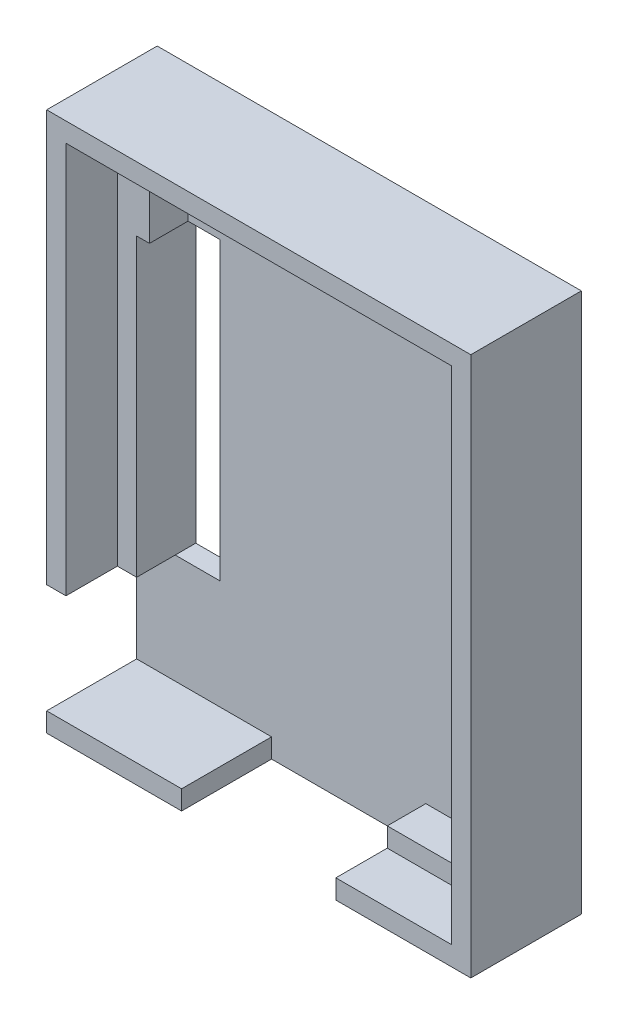
ISO-10303-21;
HEADER;
FILE_DESCRIPTION(('STEP AP214'),'2;1');
FILE_NAME('part.step','',(''),(''),'','','');
FILE_SCHEMA(('AUTOMOTIVE_DESIGN { 1 0 10303 214 1 1 1 1 }'));
ENDSEC;
DATA;
#1=APPLICATION_CONTEXT('core data for automotive mechanical design processes');
#2=APPLICATION_PROTOCOL_DEFINITION('international standard','automotive_design',2000,#1);
#3=PRODUCT_CONTEXT('',#1,'mechanical');
#4=PRODUCT('Part','Part','',(#3));
#5=PRODUCT_RELATED_PRODUCT_CATEGORY('part','',(#4));
#6=PRODUCT_DEFINITION_FORMATION('','',#4);
#7=PRODUCT_DEFINITION_CONTEXT('part definition',#1,'design');
#8=PRODUCT_DEFINITION('design','',#6,#7);
#9=PRODUCT_DEFINITION_SHAPE('','',#8);
#10=(LENGTH_UNIT() NAMED_UNIT(*) SI_UNIT(.MILLI.,.METRE.));
#11=(NAMED_UNIT(*) PLANE_ANGLE_UNIT() SI_UNIT($,.RADIAN.));
#12=(NAMED_UNIT(*) SI_UNIT($,.STERADIAN.) SOLID_ANGLE_UNIT());
#13=UNCERTAINTY_MEASURE_WITH_UNIT(LENGTH_MEASURE(1.E-05),#10,'distance_accuracy_value','');
#14=(GEOMETRIC_REPRESENTATION_CONTEXT(3) GLOBAL_UNCERTAINTY_ASSIGNED_CONTEXT((#13)) GLOBAL_UNIT_ASSIGNED_CONTEXT((#10,
#11,#12)) REPRESENTATION_CONTEXT('',''));
#15=CARTESIAN_POINT('',(0.,0.,0.));
#16=DIRECTION('',(0.,0.,1.));
#17=DIRECTION('',(1.,0.,0.));
#18=AXIS2_PLACEMENT_3D('',#15,#16,#17);
#19=CARTESIAN_POINT('',(0.,0.,0.));
#20=DIRECTION('',(0.,0.,1.));
#21=DIRECTION('',(1.,0.,0.));
#22=AXIS2_PLACEMENT_3D('',#19,#20,#21);
#23=PLANE('',#22);
#24=DIRECTION('',(0.,-1.,0.));
#25=VECTOR('',#24,1.);
#26=CARTESIAN_POINT('',(-12.5,0.,0.));
#27=LINE('',#26,#25);
#28=CARTESIAN_POINT('',(-12.5,24.,0.));
#29=VERTEX_POINT('',#28);
#30=CARTESIAN_POINT('',(-12.5,19.,0.));
#31=VERTEX_POINT('',#30);
#32=EDGE_CURVE('E348',#29,#31,#27,.T.);
#33=ORIENTED_EDGE('',*,*,#32,.T.);
#34=DIRECTION('',(-1.,0.,0.));
#35=VECTOR('',#34,1.);
#36=CARTESIAN_POINT('',(0.,19.,0.));
#37=LINE('',#36,#35);
#38=CARTESIAN_POINT('',(-10.,19.,0.));
#39=VERTEX_POINT('',#38);
#40=EDGE_CURVE('E539',#39,#31,#37,.T.);
#41=ORIENTED_EDGE('',*,*,#40,.F.);
#42=DIRECTION('',(0.,-1.,0.));
#43=VECTOR('',#42,1.);
#44=CARTESIAN_POINT('',(-10.,0.,0.));
#45=LINE('',#44,#43);
#46=CARTESIAN_POINT('',(-10.,-4.,0.));
#47=VERTEX_POINT('',#46);
#48=EDGE_CURVE('E488',#39,#47,#45,.T.);
#49=ORIENTED_EDGE('',*,*,#48,.T.);
#50=DIRECTION('',(-1.,0.,0.));
#51=VECTOR('',#50,1.);
#52=CARTESIAN_POINT('',(0.,-4.,0.));
#53=LINE('',#52,#51);
#54=CARTESIAN_POINT('',(-13.5,-4.,0.));
#55=VERTEX_POINT('',#54);
#56=EDGE_CURVE('E535',#47,#55,#53,.T.);
#57=ORIENTED_EDGE('',*,*,#56,.T.);
#58=DIRECTION('',(-1.,0.,0.));
#59=VECTOR('',#58,1.);
#60=CARTESIAN_POINT('',(0.,-4.,0.));
#61=LINE('',#60,#59);
#62=CARTESIAN_POINT('',(-16.5,-4.,0.));
#63=VERTEX_POINT('',#62);
#64=EDGE_CURVE('E417',#55,#63,#61,.T.);
#65=ORIENTED_EDGE('',*,*,#64,.T.);
#66=DIRECTION('',(0.,-1.,0.));
#67=VECTOR('',#66,1.);
#68=CARTESIAN_POINT('',(-16.5,0.,0.));
#69=LINE('',#68,#67);
#70=CARTESIAN_POINT('',(-16.5,-12.5,0.));
#71=VERTEX_POINT('',#70);
#72=EDGE_CURVE('E106',#63,#71,#69,.T.);
#73=ORIENTED_EDGE('',*,*,#72,.T.);
#74=DIRECTION('',(1.,0.,0.));
#75=VECTOR('',#74,1.);
#76=CARTESIAN_POINT('',(0.,-12.5,0.));
#77=LINE('',#76,#75);
#78=CARTESIAN_POINT('',(-6.,-12.5,0.));
#79=VERTEX_POINT('',#78);
#80=EDGE_CURVE('E101',#71,#79,#77,.T.);
#81=ORIENTED_EDGE('',*,*,#80,.T.);
#82=DIRECTION('',(0.,1.,0.));
#83=VECTOR('',#82,1.);
#84=CARTESIAN_POINT('',(-6.,0.,0.));
#85=LINE('',#84,#83);
#86=CARTESIAN_POINT('',(-6.,-14.,0.));
#87=VERTEX_POINT('',#86);
#88=EDGE_CURVE('E392',#87,#79,#85,.T.);
#89=ORIENTED_EDGE('',*,*,#88,.F.);
#90=DIRECTION('',(1.,0.,0.));
#91=VECTOR('',#90,1.);
#92=CARTESIAN_POINT('',(0.,-14.,0.));
#93=LINE('',#92,#91);
#94=CARTESIAN_POINT('',(6.,-14.,0.));
#95=VERTEX_POINT('',#94);
#96=EDGE_CURVE('E494',#87,#95,#93,.T.);
#97=ORIENTED_EDGE('',*,*,#96,.T.);
#98=DIRECTION('',(0.,1.,0.));
#99=VECTOR('',#98,1.);
#100=CARTESIAN_POINT('',(6.,0.,0.));
#101=LINE('',#100,#99);
#102=CARTESIAN_POINT('',(6.,-11.,0.));
#103=VERTEX_POINT('',#102);
#104=EDGE_CURVE('E423',#95,#103,#101,.T.);
#105=ORIENTED_EDGE('',*,*,#104,.T.);
#106=DIRECTION('',(1.,0.,0.));
#107=VECTOR('',#106,1.);
#108=CARTESIAN_POINT('',(0.,-11.,0.));
#109=LINE('',#108,#107);
#110=CARTESIAN_POINT('',(13.5,-11.,0.));
#111=VERTEX_POINT('',#110);
#112=EDGE_CURVE('E299',#103,#111,#109,.T.);
#113=ORIENTED_EDGE('',*,*,#112,.T.);
#114=DIRECTION('',(0.,-1.,0.));
#115=VECTOR('',#114,1.);
#116=CARTESIAN_POINT('',(13.5,0.,0.));
#117=LINE('',#116,#115);
#118=CARTESIAN_POINT('',(13.5,-4.,0.));
#119=VERTEX_POINT('',#118);
#120=EDGE_CURVE('E359',#119,#111,#117,.T.);
#121=ORIENTED_EDGE('',*,*,#120,.F.);
#122=DIRECTION('',(1.,0.,0.));
#123=VECTOR('',#122,1.);
#124=CARTESIAN_POINT('',(0.,-4.,0.));
#125=LINE('',#124,#123);
#126=CARTESIAN_POINT('',(10.,-4.,0.));
#127=VERTEX_POINT('',#126);
#128=EDGE_CURVE('E542',#127,#119,#125,.T.);
#129=ORIENTED_EDGE('',*,*,#128,.F.);
#130=DIRECTION('',(0.,-1.,0.));
#131=VECTOR('',#130,1.);
#132=CARTESIAN_POINT('',(10.,0.,0.));
#133=LINE('',#132,#131);
#134=CARTESIAN_POINT('',(10.,19.,0.));
#135=VERTEX_POINT('',#134);
#136=EDGE_CURVE('E546',#135,#127,#133,.T.);
#137=ORIENTED_EDGE('',*,*,#136,.F.);
#138=DIRECTION('',(1.,0.,0.));
#139=VECTOR('',#138,1.);
#140=CARTESIAN_POINT('',(0.,19.,0.));
#141=LINE('',#140,#139);
#142=CARTESIAN_POINT('',(12.5,19.,0.));
#143=VERTEX_POINT('',#142);
#144=EDGE_CURVE('E549',#135,#143,#141,.T.);
#145=ORIENTED_EDGE('',*,*,#144,.T.);
#146=DIRECTION('',(0.,-1.,0.));
#147=VECTOR('',#146,1.);
#148=CARTESIAN_POINT('',(12.5,0.,0.));
#149=LINE('',#148,#147);
#150=CARTESIAN_POINT('',(12.5,24.,0.));
#151=VERTEX_POINT('',#150);
#152=EDGE_CURVE('E356',#151,#143,#149,.T.);
#153=ORIENTED_EDGE('',*,*,#152,.F.);
#154=DIRECTION('',(-1.,0.,0.));
#155=VECTOR('',#154,1.);
#156=CARTESIAN_POINT('',(0.,24.,0.));
#157=LINE('',#156,#155);
#158=EDGE_CURVE('E352',#151,#29,#157,.T.);
#159=ORIENTED_EDGE('',*,*,#158,.T.);
#160=EDGE_LOOP('',(#33,#41,#49,#57,#65,#73,#81,#89,#97,#105,#113,#121,#129,#137,#145,#153,#159));
#161=FACE_BOUND('',#160,.T.);
#162=ADVANCED_FACE('F83',(#161),#23,.T.);
#163=CARTESIAN_POINT('',(-16.5,0.,-1.6));
#164=DIRECTION('',(-1.,0.,0.));
#165=DIRECTION('',(0.,0.,1.));
#166=AXIS2_PLACEMENT_3D('',#163,#164,#165);
#167=PLANE('',#166);
#168=ORIENTED_EDGE('',*,*,#72,.F.);
#169=DIRECTION('',(0.,0.,-1.));
#170=VECTOR('',#169,1.);
#171=CARTESIAN_POINT('',(-16.5,-4.,7.));
#172=LINE('',#171,#170);
#173=CARTESIAN_POINT('',(-16.5,-4.,7.));
#174=VERTEX_POINT('',#173);
#175=EDGE_CURVE('E485',#174,#63,#172,.T.);
#176=ORIENTED_EDGE('',*,*,#175,.F.);
#177=DIRECTION('',(0.,-1.,0.));
#178=VECTOR('',#177,1.);
#179=CARTESIAN_POINT('',(-16.5,0.,7.));
#180=LINE('',#179,#178);
#181=CARTESIAN_POINT('',(-16.5,28.,7.));
#182=VERTEX_POINT('',#181);
#183=EDGE_CURVE('E422',#182,#174,#180,.T.);
#184=ORIENTED_EDGE('',*,*,#183,.F.);
#185=DIRECTION('',(0.,0.,1.));
#186=VECTOR('',#185,1.);
#187=CARTESIAN_POINT('',(-16.5,28.,-1.6));
#188=LINE('',#187,#186);
#189=CARTESIAN_POINT('',(-16.5,28.,-1.6));
#190=VERTEX_POINT('',#189);
#191=EDGE_CURVE('E12',#190,#182,#188,.T.);
#192=ORIENTED_EDGE('',*,*,#191,.F.);
#193=DIRECTION('',(0.,-1.,0.));
#194=VECTOR('',#193,1.);
#195=CARTESIAN_POINT('',(-16.5,0.,-1.6));
#196=LINE('',#195,#194);
#197=CARTESIAN_POINT('',(-16.5,-14.,-1.6));
#198=VERTEX_POINT('',#197);
#199=EDGE_CURVE('E517',#190,#198,#196,.T.);
#200=ORIENTED_EDGE('',*,*,#199,.T.);
#201=DIRECTION('',(0.,0.,1.));
#202=VECTOR('',#201,1.);
#203=CARTESIAN_POINT('',(-16.5,-14.,-1.6));
#204=LINE('',#203,#202);
#205=CARTESIAN_POINT('',(-16.5,-14.,7.));
#206=VERTEX_POINT('',#205);
#207=EDGE_CURVE('E562',#198,#206,#204,.T.);
#208=ORIENTED_EDGE('',*,*,#207,.T.);
#209=DIRECTION('',(0.,-1.,0.));
#210=VECTOR('',#209,1.);
#211=CARTESIAN_POINT('',(-16.5,0.,7.));
#212=LINE('',#211,#210);
#213=CARTESIAN_POINT('',(-16.5,-12.5,7.));
#214=VERTEX_POINT('',#213);
#215=EDGE_CURVE('E391',#214,#206,#212,.T.);
#216=ORIENTED_EDGE('',*,*,#215,.F.);
#217=DIRECTION('',(0.,0.,-1.));
#218=VECTOR('',#217,1.);
#219=CARTESIAN_POINT('',(-16.5,-12.5,7.));
#220=LINE('',#219,#218);
#221=EDGE_CURVE('E414',#214,#71,#220,.T.);
#222=ORIENTED_EDGE('',*,*,#221,.T.);
#223=EDGE_LOOP('',(#168,#176,#184,#192,#200,#208,#216,#222));
#224=FACE_BOUND('',#223,.T.);
#225=ADVANCED_FACE('F599',(#224),#167,.T.);
#226=CARTESIAN_POINT('',(0.,28.,-1.6));
#227=DIRECTION('',(0.,-1.,0.));
#228=DIRECTION('',(0.,0.,-1.));
#229=AXIS2_PLACEMENT_3D('',#226,#227,#228);
#230=PLANE('',#229);
#231=ORIENTED_EDGE('',*,*,#191,.T.);
#232=DIRECTION('',(1.,0.,0.));
#233=VECTOR('',#232,1.);
#234=CARTESIAN_POINT('',(0.,28.,7.));
#235=LINE('',#234,#233);
#236=CARTESIAN_POINT('',(16.5,28.,7.));
#237=VERTEX_POINT('',#236);
#238=EDGE_CURVE('E418',#182,#237,#235,.T.);
#239=ORIENTED_EDGE('',*,*,#238,.T.);
#240=DIRECTION('',(0.,0.,1.));
#241=VECTOR('',#240,1.);
#242=CARTESIAN_POINT('',(16.5,28.,-1.6));
#243=LINE('',#242,#241);
#244=CARTESIAN_POINT('',(16.5,28.,-1.6));
#245=VERTEX_POINT('',#244);
#246=EDGE_CURVE('E93',#245,#237,#243,.T.);
#247=ORIENTED_EDGE('',*,*,#246,.F.);
#248=DIRECTION('',(1.,0.,0.));
#249=VECTOR('',#248,1.);
#250=CARTESIAN_POINT('',(0.,28.,-1.6));
#251=LINE('',#250,#249);
#252=EDGE_CURVE('E529',#190,#245,#251,.T.);
#253=ORIENTED_EDGE('',*,*,#252,.F.);
#254=EDGE_LOOP('',(#231,#239,#247,#253));
#255=FACE_BOUND('',#254,.T.);
#256=ADVANCED_FACE('F677',(#255),#230,.F.);
#257=CARTESIAN_POINT('',(16.5,0.,-1.6));
#258=DIRECTION('',(1.,0.,0.));
#259=DIRECTION('',(0.,0.,-1.));
#260=AXIS2_PLACEMENT_3D('',#257,#258,#259);
#261=PLANE('',#260);
#262=ORIENTED_EDGE('',*,*,#246,.T.);
#263=DIRECTION('',(0.,1.,0.));
#264=VECTOR('',#263,1.);
#265=CARTESIAN_POINT('',(16.5,0.,7.));
#266=LINE('',#265,#264);
#267=CARTESIAN_POINT('',(16.5,-14.,7.));
#268=VERTEX_POINT('',#267);
#269=EDGE_CURVE('E453',#268,#237,#266,.T.);
#270=ORIENTED_EDGE('',*,*,#269,.F.);
#271=DIRECTION('',(0.,0.,1.));
#272=VECTOR('',#271,1.);
#273=CARTESIAN_POINT('',(16.5,-14.,-1.6));
#274=LINE('',#273,#272);
#275=CARTESIAN_POINT('',(16.5,-14.,-1.6));
#276=VERTEX_POINT('',#275);
#277=EDGE_CURVE('E559',#276,#268,#274,.T.);
#278=ORIENTED_EDGE('',*,*,#277,.F.);
#279=DIRECTION('',(0.,1.,0.));
#280=VECTOR('',#279,1.);
#281=CARTESIAN_POINT('',(16.5,0.,-1.6));
#282=LINE('',#281,#280);
#283=EDGE_CURVE('E525',#276,#245,#282,.T.);
#284=ORIENTED_EDGE('',*,*,#283,.T.);
#285=EDGE_LOOP('',(#262,#270,#278,#284));
#286=FACE_BOUND('',#285,.T.);
#287=ADVANCED_FACE('F703',(#286),#261,.T.);
#288=CARTESIAN_POINT('',(0.,-4.,-1.6));
#289=DIRECTION('',(0.,-1.,0.));
#290=DIRECTION('',(0.,0.,-1.));
#291=AXIS2_PLACEMENT_3D('',#288,#289,#290);
#292=PLANE('',#291);
#293=ORIENTED_EDGE('',*,*,#128,.T.);
#294=DIRECTION('',(0.,0.,1.));
#295=VECTOR('',#294,1.);
#296=CARTESIAN_POINT('',(13.5,-4.,-1.6));
#297=LINE('',#296,#295);
#298=CARTESIAN_POINT('',(13.5,-4.,-1.6));
#299=VERTEX_POINT('',#298);
#300=EDGE_CURVE('E565',#299,#119,#297,.T.);
#301=ORIENTED_EDGE('',*,*,#300,.F.);
#302=DIRECTION('',(1.,0.,0.));
#303=VECTOR('',#302,1.);
#304=CARTESIAN_POINT('',(0.,-4.,-1.6));
#305=LINE('',#304,#303);
#306=CARTESIAN_POINT('',(10.,-4.,-1.6));
#307=VERTEX_POINT('',#306);
#308=EDGE_CURVE('E503',#307,#299,#305,.T.);
#309=ORIENTED_EDGE('',*,*,#308,.F.);
#310=DIRECTION('',(0.,0.,1.));
#311=VECTOR('',#310,1.);
#312=CARTESIAN_POINT('',(10.,-4.,-1.6));
#313=LINE('',#312,#311);
#314=EDGE_CURVE('E575',#307,#127,#313,.T.);
#315=ORIENTED_EDGE('',*,*,#314,.T.);
#316=EDGE_LOOP('',(#293,#301,#309,#315));
#317=FACE_BOUND('',#316,.T.);
#318=ADVANCED_FACE('F630',(#317),#292,.F.);
#319=CARTESIAN_POINT('',(13.5,0.,-1.6));
#320=DIRECTION('',(-1.,0.,0.));
#321=DIRECTION('',(0.,0.,1.));
#322=AXIS2_PLACEMENT_3D('',#319,#320,#321);
#323=PLANE('',#322);
#324=ORIENTED_EDGE('',*,*,#300,.T.);
#325=ORIENTED_EDGE('',*,*,#120,.T.);
#326=DIRECTION('',(0.,0.,-1.));
#327=VECTOR('',#326,1.);
#328=CARTESIAN_POINT('',(13.5,-11.,3.));
#329=LINE('',#328,#327);
#330=CARTESIAN_POINT('',(13.5,-11.,3.));
#331=VERTEX_POINT('',#330);
#332=EDGE_CURVE('E371',#331,#111,#329,.T.);
#333=ORIENTED_EDGE('',*,*,#332,.F.);
#334=DIRECTION('',(0.,-1.,0.));
#335=VECTOR('',#334,1.);
#336=CARTESIAN_POINT('',(13.5,0.,3.));
#337=LINE('',#336,#335);
#338=CARTESIAN_POINT('',(13.5,19.,3.));
#339=VERTEX_POINT('',#338);
#340=EDGE_CURVE('E321',#339,#331,#337,.T.);
#341=ORIENTED_EDGE('',*,*,#340,.F.);
#342=DIRECTION('',(0.,0.,1.));
#343=VECTOR('',#342,1.);
#344=CARTESIAN_POINT('',(13.5,19.,-1.6));
#345=LINE('',#344,#343);
#346=CARTESIAN_POINT('',(13.5,19.,-1.6));
#347=VERTEX_POINT('',#346);
#348=EDGE_CURVE('E569',#347,#339,#345,.T.);
#349=ORIENTED_EDGE('',*,*,#348,.F.);
#350=DIRECTION('',(0.,-1.,0.));
#351=VECTOR('',#350,1.);
#352=CARTESIAN_POINT('',(13.5,0.,-1.6));
#353=LINE('',#352,#351);
#354=EDGE_CURVE('E513',#347,#299,#353,.T.);
#355=ORIENTED_EDGE('',*,*,#354,.T.);
#356=EDGE_LOOP('',(#324,#325,#333,#341,#349,#355));
#357=FACE_BOUND('',#356,.T.);
#358=ADVANCED_FACE('F626',(#357),#323,.T.);
#359=CARTESIAN_POINT('',(0.,19.,-1.6));
#360=DIRECTION('',(0.,-1.,0.));
#361=DIRECTION('',(0.,0.,-1.));
#362=AXIS2_PLACEMENT_3D('',#359,#360,#361);
#363=PLANE('',#362);
#364=ORIENTED_EDGE('',*,*,#144,.F.);
#365=DIRECTION('',(0.,0.,1.));
#366=VECTOR('',#365,1.);
#367=CARTESIAN_POINT('',(10.,19.,-1.6));
#368=LINE('',#367,#366);
#369=CARTESIAN_POINT('',(10.,19.,-1.6));
#370=VERTEX_POINT('',#369);
#371=EDGE_CURVE('E572',#370,#135,#368,.T.);
#372=ORIENTED_EDGE('',*,*,#371,.F.);
#373=DIRECTION('',(1.,0.,0.));
#374=VECTOR('',#373,1.);
#375=CARTESIAN_POINT('',(0.,19.,-1.6));
#376=LINE('',#375,#374);
#377=EDGE_CURVE('E509',#370,#347,#376,.T.);
#378=ORIENTED_EDGE('',*,*,#377,.T.);
#379=ORIENTED_EDGE('',*,*,#348,.T.);
#380=DIRECTION('',(1.,0.,0.));
#381=VECTOR('',#380,1.);
#382=CARTESIAN_POINT('',(0.,19.,3.));
#383=LINE('',#382,#381);
#384=CARTESIAN_POINT('',(12.5,19.,3.));
#385=VERTEX_POINT('',#384);
#386=EDGE_CURVE('E317',#385,#339,#383,.T.);
#387=ORIENTED_EDGE('',*,*,#386,.F.);
#388=DIRECTION('',(0.,0.,-1.));
#389=VECTOR('',#388,1.);
#390=CARTESIAN_POINT('',(12.5,19.,3.));
#391=LINE('',#390,#389);
#392=EDGE_CURVE('E375',#385,#143,#391,.T.);
#393=ORIENTED_EDGE('',*,*,#392,.T.);
#394=EDGE_LOOP('',(#364,#372,#378,#379,#387,#393));
#395=FACE_BOUND('',#394,.T.);
#396=ADVANCED_FACE('F639',(#395),#363,.T.);
#397=CARTESIAN_POINT('',(-10.,0.,-1.6));
#398=DIRECTION('',(-1.,0.,0.));
#399=DIRECTION('',(0.,0.,1.));
#400=AXIS2_PLACEMENT_3D('',#397,#398,#399);
#401=PLANE('',#400);
#402=ORIENTED_EDGE('',*,*,#48,.F.);
#403=DIRECTION('',(0.,0.,1.));
#404=VECTOR('',#403,1.);
#405=CARTESIAN_POINT('',(-10.,19.,-1.6));
#406=LINE('',#405,#404);
#407=CARTESIAN_POINT('',(-10.,19.,-1.6));
#408=VERTEX_POINT('',#407);
#409=EDGE_CURVE('E287',#408,#39,#406,.T.);
#410=ORIENTED_EDGE('',*,*,#409,.F.);
#411=DIRECTION('',(0.,-1.,0.));
#412=VECTOR('',#411,1.);
#413=CARTESIAN_POINT('',(-10.,0.,-1.6));
#414=LINE('',#413,#412);
#415=CARTESIAN_POINT('',(-10.,-4.,-1.6));
#416=VERTEX_POINT('',#415);
#417=EDGE_CURVE('E489',#408,#416,#414,.T.);
#418=ORIENTED_EDGE('',*,*,#417,.T.);
#419=DIRECTION('',(0.,0.,1.));
#420=VECTOR('',#419,1.);
#421=CARTESIAN_POINT('',(-10.,-4.,-1.6));
#422=LINE('',#421,#420);
#423=EDGE_CURVE('E87',#416,#47,#422,.T.);
#424=ORIENTED_EDGE('',*,*,#423,.T.);
#425=EDGE_LOOP('',(#402,#410,#418,#424));
#426=FACE_BOUND('',#425,.T.);
#427=ADVANCED_FACE('F85',(#426),#401,.T.);
#428=CARTESIAN_POINT('',(0.,19.,-1.6));
#429=DIRECTION('',(0.,1.,0.));
#430=DIRECTION('',(0.,0.,1.));
#431=AXIS2_PLACEMENT_3D('',#428,#429,#430);
#432=PLANE('',#431);
#433=ORIENTED_EDGE('',*,*,#40,.T.);
#434=DIRECTION('',(0.,0.,-1.));
#435=VECTOR('',#434,1.);
#436=CARTESIAN_POINT('',(-12.5,19.,3.));
#437=LINE('',#436,#435);
#438=CARTESIAN_POINT('',(-12.5,19.,3.));
#439=VERTEX_POINT('',#438);
#440=EDGE_CURVE('E303',#439,#31,#437,.T.);
#441=ORIENTED_EDGE('',*,*,#440,.F.);
#442=DIRECTION('',(-1.,0.,0.));
#443=VECTOR('',#442,1.);
#444=CARTESIAN_POINT('',(0.,19.,3.));
#445=LINE('',#444,#443);
#446=CARTESIAN_POINT('',(-13.5,19.,3.));
#447=VERTEX_POINT('',#446);
#448=EDGE_CURVE('E294',#439,#447,#445,.T.);
#449=ORIENTED_EDGE('',*,*,#448,.T.);
#450=DIRECTION('',(0.,0.,1.));
#451=VECTOR('',#450,1.);
#452=CARTESIAN_POINT('',(-13.5,19.,-1.6));
#453=LINE('',#452,#451);
#454=CARTESIAN_POINT('',(-13.5,19.,-1.6));
#455=VERTEX_POINT('',#454);
#456=EDGE_CURVE('E275',#455,#447,#453,.T.);
#457=ORIENTED_EDGE('',*,*,#456,.F.);
#458=DIRECTION('',(-1.,0.,0.));
#459=VECTOR('',#458,1.);
#460=CARTESIAN_POINT('',(0.,19.,-1.6));
#461=LINE('',#460,#459);
#462=EDGE_CURVE('E500',#408,#455,#461,.T.);
#463=ORIENTED_EDGE('',*,*,#462,.F.);
#464=ORIENTED_EDGE('',*,*,#409,.T.);
#465=EDGE_LOOP('',(#433,#441,#449,#457,#463,#464));
#466=FACE_BOUND('',#465,.T.);
#467=ADVANCED_FACE('F302',(#466),#432,.F.);
#468=CARTESIAN_POINT('',(-13.5,0.,-1.6));
#469=DIRECTION('',(-1.,0.,0.));
#470=DIRECTION('',(0.,0.,1.));
#471=AXIS2_PLACEMENT_3D('',#468,#469,#470);
#472=PLANE('',#471);
#473=ORIENTED_EDGE('',*,*,#456,.T.);
#474=DIRECTION('',(0.,-1.,0.));
#475=VECTOR('',#474,1.);
#476=CARTESIAN_POINT('',(-13.5,0.,3.));
#477=LINE('',#476,#475);
#478=CARTESIAN_POINT('',(-13.5,-4.,3.));
#479=VERTEX_POINT('',#478);
#480=EDGE_CURVE('E279',#447,#479,#477,.T.);
#481=ORIENTED_EDGE('',*,*,#480,.T.);
#482=DIRECTION('',(0.,0.,-1.));
#483=VECTOR('',#482,1.);
#484=CARTESIAN_POINT('',(-13.5,-4.,3.));
#485=LINE('',#484,#483);
#486=EDGE_CURVE('E347',#479,#55,#485,.T.);
#487=ORIENTED_EDGE('',*,*,#486,.T.);
#488=DIRECTION('',(0.,0.,1.));
#489=VECTOR('',#488,1.);
#490=CARTESIAN_POINT('',(-13.5,-4.,-1.6));
#491=LINE('',#490,#489);
#492=CARTESIAN_POINT('',(-13.5,-4.,-1.6));
#493=VERTEX_POINT('',#492);
#494=EDGE_CURVE('E288',#493,#55,#491,.T.);
#495=ORIENTED_EDGE('',*,*,#494,.F.);
#496=DIRECTION('',(0.,-1.,0.));
#497=VECTOR('',#496,1.);
#498=CARTESIAN_POINT('',(-13.5,0.,-1.6));
#499=LINE('',#498,#497);
#500=EDGE_CURVE('E282',#455,#493,#499,.T.);
#501=ORIENTED_EDGE('',*,*,#500,.F.);
#502=EDGE_LOOP('',(#473,#481,#487,#495,#501));
#503=FACE_BOUND('',#502,.T.);
#504=ADVANCED_FACE('F277',(#503),#472,.F.);
#505=CARTESIAN_POINT('',(10.,0.,-1.6));
#506=DIRECTION('',(-1.,0.,0.));
#507=DIRECTION('',(0.,0.,1.));
#508=AXIS2_PLACEMENT_3D('',#505,#506,#507);
#509=PLANE('',#508);
#510=ORIENTED_EDGE('',*,*,#136,.T.);
#511=ORIENTED_EDGE('',*,*,#314,.F.);
#512=DIRECTION('',(0.,-1.,0.));
#513=VECTOR('',#512,1.);
#514=CARTESIAN_POINT('',(10.,0.,-1.6));
#515=LINE('',#514,#513);
#516=EDGE_CURVE('E506',#370,#307,#515,.T.);
#517=ORIENTED_EDGE('',*,*,#516,.F.);
#518=ORIENTED_EDGE('',*,*,#371,.T.);
#519=EDGE_LOOP('',(#510,#511,#517,#518));
#520=FACE_BOUND('',#519,.T.);
#521=ADVANCED_FACE('F634',(#520),#509,.F.);
#522=CARTESIAN_POINT('',(0.,-4.,-1.6));
#523=DIRECTION('',(0.,1.,0.));
#524=DIRECTION('',(0.,0.,1.));
#525=AXIS2_PLACEMENT_3D('',#522,#523,#524);
#526=PLANE('',#525);
#527=ORIENTED_EDGE('',*,*,#56,.F.);
#528=ORIENTED_EDGE('',*,*,#423,.F.);
#529=DIRECTION('',(-1.,0.,0.));
#530=VECTOR('',#529,1.);
#531=CARTESIAN_POINT('',(0.,-4.,-1.6));
#532=LINE('',#531,#530);
#533=EDGE_CURVE('E493',#416,#493,#532,.T.);
#534=ORIENTED_EDGE('',*,*,#533,.T.);
#535=ORIENTED_EDGE('',*,*,#494,.T.);
#536=EDGE_LOOP('',(#527,#528,#534,#535));
#537=FACE_BOUND('',#536,.T.);
#538=ADVANCED_FACE('F589',(#537),#526,.T.);
#539=CARTESIAN_POINT('',(0.,-14.,-1.6));
#540=DIRECTION('',(0.,-1.,0.));
#541=DIRECTION('',(0.,0.,-1.));
#542=AXIS2_PLACEMENT_3D('',#539,#540,#541);
#543=PLANE('',#542);
#544=ORIENTED_EDGE('',*,*,#96,.F.);
#545=DIRECTION('',(0.,0.,-1.));
#546=VECTOR('',#545,1.);
#547=CARTESIAN_POINT('',(-6.,-14.,7.));
#548=LINE('',#547,#546);
#549=CARTESIAN_POINT('',(-6.,-14.,7.));
#550=VERTEX_POINT('',#549);
#551=EDGE_CURVE('E410',#550,#87,#548,.T.);
#552=ORIENTED_EDGE('',*,*,#551,.F.);
#553=DIRECTION('',(1.,0.,0.));
#554=VECTOR('',#553,1.);
#555=CARTESIAN_POINT('',(0.,-14.,7.));
#556=LINE('',#555,#554);
#557=EDGE_CURVE('E396',#206,#550,#556,.T.);
#558=ORIENTED_EDGE('',*,*,#557,.F.);
#559=ORIENTED_EDGE('',*,*,#207,.F.);
#560=DIRECTION('',(1.,0.,0.));
#561=VECTOR('',#560,1.);
#562=CARTESIAN_POINT('',(0.,-14.,-1.6));
#563=LINE('',#562,#561);
#564=EDGE_CURVE('E521',#198,#276,#563,.T.);
#565=ORIENTED_EDGE('',*,*,#564,.T.);
#566=ORIENTED_EDGE('',*,*,#277,.T.);
#567=DIRECTION('',(1.,0.,0.));
#568=VECTOR('',#567,1.);
#569=CARTESIAN_POINT('',(0.,-14.,7.));
#570=LINE('',#569,#568);
#571=CARTESIAN_POINT('',(6.,-14.,7.));
#572=VERTEX_POINT('',#571);
#573=EDGE_CURVE('E449',#572,#268,#570,.T.);
#574=ORIENTED_EDGE('',*,*,#573,.F.);
#575=DIRECTION('',(0.,0.,-1.));
#576=VECTOR('',#575,1.);
#577=CARTESIAN_POINT('',(6.,-14.,7.));
#578=LINE('',#577,#576);
#579=EDGE_CURVE('E457',#572,#95,#578,.T.);
#580=ORIENTED_EDGE('',*,*,#579,.T.);
#581=EDGE_LOOP('',(#544,#552,#558,#559,#565,#566,#574,#580));
#582=FACE_BOUND('',#581,.T.);
#583=ADVANCED_FACE('F613',(#582),#543,.T.);
#584=CARTESIAN_POINT('',(0.,0.,-1.6));
#585=DIRECTION('',(0.,0.,1.));
#586=DIRECTION('',(1.,0.,0.));
#587=AXIS2_PLACEMENT_3D('',#584,#585,#586);
#588=PLANE('',#587);
#589=ORIENTED_EDGE('',*,*,#417,.F.);
#590=ORIENTED_EDGE('',*,*,#462,.T.);
#591=ORIENTED_EDGE('',*,*,#500,.T.);
#592=ORIENTED_EDGE('',*,*,#533,.F.);
#593=EDGE_LOOP('',(#589,#590,#591,#592));
#594=FACE_BOUND('',#593,.T.);
#595=ORIENTED_EDGE('',*,*,#308,.T.);
#596=ORIENTED_EDGE('',*,*,#354,.F.);
#597=ORIENTED_EDGE('',*,*,#377,.F.);
#598=ORIENTED_EDGE('',*,*,#516,.T.);
#599=EDGE_LOOP('',(#595,#596,#597,#598));
#600=FACE_BOUND('',#599,.T.);
#601=ORIENTED_EDGE('',*,*,#199,.F.);
#602=ORIENTED_EDGE('',*,*,#252,.T.);
#603=ORIENTED_EDGE('',*,*,#283,.F.);
#604=ORIENTED_EDGE('',*,*,#564,.F.);
#605=EDGE_LOOP('',(#601,#602,#603,#604));
#606=FACE_BOUND('',#605,.T.);
#607=ADVANCED_FACE('F593',(#594,#600,#606),#588,.F.);
#608=CARTESIAN_POINT('',(0.,-4.,7.));
#609=DIRECTION('',(0.,-1.,0.));
#610=DIRECTION('',(0.,0.,-1.));
#611=AXIS2_PLACEMENT_3D('',#608,#609,#610);
#612=PLANE('',#611);
#613=ORIENTED_EDGE('',*,*,#64,.F.);
#614=ORIENTED_EDGE('',*,*,#486,.F.);
#615=DIRECTION('',(-1.,0.,0.));
#616=VECTOR('',#615,1.);
#617=CARTESIAN_POINT('',(0.,-4.,3.));
#618=LINE('',#617,#616);
#619=CARTESIAN_POINT('',(-15.,-4.,3.));
#620=VERTEX_POINT('',#619);
#621=EDGE_CURVE('E297',#479,#620,#618,.T.);
#622=ORIENTED_EDGE('',*,*,#621,.T.);
#623=DIRECTION('',(0.,0.,-1.));
#624=VECTOR('',#623,1.);
#625=CARTESIAN_POINT('',(-15.,-4.,7.));
#626=LINE('',#625,#624);
#627=CARTESIAN_POINT('',(-15.,-4.,7.));
#628=VERTEX_POINT('',#627);
#629=EDGE_CURVE('E481',#628,#620,#626,.T.);
#630=ORIENTED_EDGE('',*,*,#629,.F.);
#631=DIRECTION('',(-1.,0.,0.));
#632=VECTOR('',#631,1.);
#633=CARTESIAN_POINT('',(0.,-4.,7.));
#634=LINE('',#633,#632);
#635=EDGE_CURVE('E426',#628,#174,#634,.T.);
#636=ORIENTED_EDGE('',*,*,#635,.T.);
#637=ORIENTED_EDGE('',*,*,#175,.T.);
#638=EDGE_LOOP('',(#613,#614,#622,#630,#636,#637));
#639=FACE_BOUND('',#638,.T.);
#640=ADVANCED_FACE('F596',(#639),#612,.T.);
#641=CARTESIAN_POINT('',(-15.,0.,7.));
#642=DIRECTION('',(1.,0.,0.));
#643=DIRECTION('',(0.,1.,0.));
#644=AXIS2_PLACEMENT_3D('',#641,#642,#643);
#645=PLANE('',#644);
#646=DIRECTION('',(0.,-1.,0.));
#647=VECTOR('',#646,1.);
#648=CARTESIAN_POINT('',(-15.,0.,3.));
#649=LINE('',#648,#647);
#650=CARTESIAN_POINT('',(-15.,26.5,3.));
#651=VERTEX_POINT('',#650);
#652=EDGE_CURVE('E342',#651,#620,#649,.T.);
#653=ORIENTED_EDGE('',*,*,#652,.F.);
#654=DIRECTION('',(0.,0.,-1.));
#655=VECTOR('',#654,1.);
#656=CARTESIAN_POINT('',(-15.,26.5,7.));
#657=LINE('',#656,#655);
#658=CARTESIAN_POINT('',(-15.,26.5,7.));
#659=VERTEX_POINT('',#658);
#660=EDGE_CURVE('E477',#659,#651,#657,.T.);
#661=ORIENTED_EDGE('',*,*,#660,.F.);
#662=DIRECTION('',(0.,-1.,0.));
#663=VECTOR('',#662,1.);
#664=CARTESIAN_POINT('',(-15.,0.,7.));
#665=LINE('',#664,#663);
#666=EDGE_CURVE('E430',#659,#628,#665,.T.);
#667=ORIENTED_EDGE('',*,*,#666,.T.);
#668=ORIENTED_EDGE('',*,*,#629,.T.);
#669=EDGE_LOOP('',(#653,#661,#667,#668));
#670=FACE_BOUND('',#669,.T.);
#671=ADVANCED_FACE('F671',(#670),#645,.T.);
#672=CARTESIAN_POINT('',(0.,26.5,7.));
#673=DIRECTION('',(0.,-1.,0.));
#674=DIRECTION('',(0.,0.,-1.));
#675=AXIS2_PLACEMENT_3D('',#672,#673,#674);
#676=PLANE('',#675);
#677=DIRECTION('',(1.,0.,0.));
#678=VECTOR('',#677,1.);
#679=CARTESIAN_POINT('',(0.,26.5,3.));
#680=LINE('',#679,#678);
#681=CARTESIAN_POINT('',(15.,26.5,3.));
#682=VERTEX_POINT('',#681);
#683=EDGE_CURVE('E338',#651,#682,#680,.T.);
#684=ORIENTED_EDGE('',*,*,#683,.T.);
#685=DIRECTION('',(0.,0.,-1.));
#686=VECTOR('',#685,1.);
#687=CARTESIAN_POINT('',(15.,26.5,7.));
#688=LINE('',#687,#686);
#689=CARTESIAN_POINT('',(15.,26.5,7.));
#690=VERTEX_POINT('',#689);
#691=EDGE_CURVE('E473',#690,#682,#688,.T.);
#692=ORIENTED_EDGE('',*,*,#691,.F.);
#693=DIRECTION('',(-1.,0.,0.));
#694=VECTOR('',#693,1.);
#695=CARTESIAN_POINT('',(0.,26.5,7.));
#696=LINE('',#695,#694);
#697=EDGE_CURVE('E434',#690,#659,#696,.T.);
#698=ORIENTED_EDGE('',*,*,#697,.T.);
#699=ORIENTED_EDGE('',*,*,#660,.T.);
#700=EDGE_LOOP('',(#684,#692,#698,#699));
#701=FACE_BOUND('',#700,.T.);
#702=ADVANCED_FACE('F669',(#701),#676,.T.);
#703=CARTESIAN_POINT('',(15.,0.,7.));
#704=DIRECTION('',(1.,0.,0.));
#705=DIRECTION('',(0.,0.,-1.));
#706=AXIS2_PLACEMENT_3D('',#703,#704,#705);
#707=PLANE('',#706);
#708=ORIENTED_EDGE('',*,*,#691,.T.);
#709=DIRECTION('',(0.,1.,0.));
#710=VECTOR('',#709,1.);
#711=CARTESIAN_POINT('',(15.,0.,3.));
#712=LINE('',#711,#710);
#713=CARTESIAN_POINT('',(15.,-12.5,3.));
#714=VERTEX_POINT('',#713);
#715=EDGE_CURVE('E335',#714,#682,#712,.T.);
#716=ORIENTED_EDGE('',*,*,#715,.F.);
#717=DIRECTION('',(0.,0.,-1.));
#718=VECTOR('',#717,1.);
#719=CARTESIAN_POINT('',(15.,-12.5,7.));
#720=LINE('',#719,#718);
#721=CARTESIAN_POINT('',(15.,-12.5,7.));
#722=VERTEX_POINT('',#721);
#723=EDGE_CURVE('E469',#722,#714,#720,.T.);
#724=ORIENTED_EDGE('',*,*,#723,.F.);
#725=DIRECTION('',(0.,-1.,0.));
#726=VECTOR('',#725,1.);
#727=CARTESIAN_POINT('',(15.,0.,7.));
#728=LINE('',#727,#726);
#729=EDGE_CURVE('E438',#690,#722,#728,.T.);
#730=ORIENTED_EDGE('',*,*,#729,.F.);
#731=EDGE_LOOP('',(#708,#716,#724,#730));
#732=FACE_BOUND('',#731,.T.);
#733=ADVANCED_FACE('F666',(#732),#707,.F.);
#734=CARTESIAN_POINT('',(0.,-12.5,7.));
#735=DIRECTION('',(0.,1.,0.));
#736=DIRECTION('',(0.,0.,1.));
#737=AXIS2_PLACEMENT_3D('',#734,#735,#736);
#738=PLANE('',#737);
#739=DIRECTION('',(1.,0.,0.));
#740=VECTOR('',#739,1.);
#741=CARTESIAN_POINT('',(0.,-12.5,3.));
#742=LINE('',#741,#740);
#743=CARTESIAN_POINT('',(6.,-12.5,3.));
#744=VERTEX_POINT('',#743);
#745=EDGE_CURVE('E332',#744,#714,#742,.T.);
#746=ORIENTED_EDGE('',*,*,#745,.F.);
#747=DIRECTION('',(0.,0.,-1.));
#748=VECTOR('',#747,1.);
#749=CARTESIAN_POINT('',(6.,-12.5,7.));
#750=LINE('',#749,#748);
#751=CARTESIAN_POINT('',(6.,-12.5,7.));
#752=VERTEX_POINT('',#751);
#753=EDGE_CURVE('E465',#752,#744,#750,.T.);
#754=ORIENTED_EDGE('',*,*,#753,.F.);
#755=DIRECTION('',(1.,0.,0.));
#756=VECTOR('',#755,1.);
#757=CARTESIAN_POINT('',(0.,-12.5,7.));
#758=LINE('',#757,#756);
#759=EDGE_CURVE('E441',#752,#722,#758,.T.);
#760=ORIENTED_EDGE('',*,*,#759,.T.);
#761=ORIENTED_EDGE('',*,*,#723,.T.);
#762=EDGE_LOOP('',(#746,#754,#760,#761));
#763=FACE_BOUND('',#762,.T.);
#764=ADVANCED_FACE('F655',(#763),#738,.T.);
#765=CARTESIAN_POINT('',(6.,0.,7.));
#766=DIRECTION('',(-1.,0.,0.));
#767=DIRECTION('',(0.,-1.,0.));
#768=AXIS2_PLACEMENT_3D('',#765,#766,#767);
#769=PLANE('',#768);
#770=ORIENTED_EDGE('',*,*,#104,.F.);
#771=ORIENTED_EDGE('',*,*,#579,.F.);
#772=DIRECTION('',(0.,1.,0.));
#773=VECTOR('',#772,1.);
#774=CARTESIAN_POINT('',(6.,0.,7.));
#775=LINE('',#774,#773);
#776=EDGE_CURVE('E445',#572,#752,#775,.T.);
#777=ORIENTED_EDGE('',*,*,#776,.T.);
#778=ORIENTED_EDGE('',*,*,#753,.T.);
#779=DIRECTION('',(0.,1.,0.));
#780=VECTOR('',#779,1.);
#781=CARTESIAN_POINT('',(6.,0.,3.));
#782=LINE('',#781,#780);
#783=CARTESIAN_POINT('',(6.,-11.,3.));
#784=VERTEX_POINT('',#783);
#785=EDGE_CURVE('E328',#744,#784,#782,.T.);
#786=ORIENTED_EDGE('',*,*,#785,.T.);
#787=DIRECTION('',(0.,0.,-1.));
#788=VECTOR('',#787,1.);
#789=CARTESIAN_POINT('',(6.,-11.,3.));
#790=LINE('',#789,#788);
#791=EDGE_CURVE('E367',#784,#103,#790,.T.);
#792=ORIENTED_EDGE('',*,*,#791,.T.);
#793=EDGE_LOOP('',(#770,#771,#777,#778,#786,#792));
#794=FACE_BOUND('',#793,.T.);
#795=ADVANCED_FACE('F616',(#794),#769,.T.);
#796=CARTESIAN_POINT('',(0.,0.,7.));
#797=DIRECTION('',(0.,0.,1.));
#798=DIRECTION('',(1.,0.,0.));
#799=AXIS2_PLACEMENT_3D('',#796,#797,#798);
#800=PLANE('',#799);
#801=ORIENTED_EDGE('',*,*,#238,.F.);
#802=ORIENTED_EDGE('',*,*,#183,.T.);
#803=ORIENTED_EDGE('',*,*,#635,.F.);
#804=ORIENTED_EDGE('',*,*,#666,.F.);
#805=ORIENTED_EDGE('',*,*,#697,.F.);
#806=ORIENTED_EDGE('',*,*,#729,.T.);
#807=ORIENTED_EDGE('',*,*,#759,.F.);
#808=ORIENTED_EDGE('',*,*,#776,.F.);
#809=ORIENTED_EDGE('',*,*,#573,.T.);
#810=ORIENTED_EDGE('',*,*,#269,.T.);
#811=EDGE_LOOP('',(#801,#802,#803,#804,#805,#806,#807,#808,#809,#810));
#812=FACE_BOUND('',#811,.T.);
#813=ADVANCED_FACE('F660',(#812),#800,.T.);
#814=CARTESIAN_POINT('',(0.,-12.5,7.));
#815=DIRECTION('',(0.,1.,0.));
#816=DIRECTION('',(0.,0.,1.));
#817=AXIS2_PLACEMENT_3D('',#814,#815,#816);
#818=PLANE('',#817);
#819=ORIENTED_EDGE('',*,*,#80,.F.);
#820=ORIENTED_EDGE('',*,*,#221,.F.);
#821=DIRECTION('',(1.,0.,0.));
#822=VECTOR('',#821,1.);
#823=CARTESIAN_POINT('',(0.,-12.5,7.));
#824=LINE('',#823,#822);
#825=CARTESIAN_POINT('',(-6.,-12.5,7.));
#826=VERTEX_POINT('',#825);
#827=EDGE_CURVE('E387',#214,#826,#824,.T.);
#828=ORIENTED_EDGE('',*,*,#827,.T.);
#829=DIRECTION('',(0.,0.,-1.));
#830=VECTOR('',#829,1.);
#831=CARTESIAN_POINT('',(-6.,-12.5,7.));
#832=LINE('',#831,#830);
#833=EDGE_CURVE('E402',#826,#79,#832,.T.);
#834=ORIENTED_EDGE('',*,*,#833,.T.);
#835=EDGE_LOOP('',(#819,#820,#828,#834));
#836=FACE_BOUND('',#835,.T.);
#837=ADVANCED_FACE('F604',(#836),#818,.T.);
#838=CARTESIAN_POINT('',(-6.,0.,7.));
#839=DIRECTION('',(-1.,0.,0.));
#840=DIRECTION('',(0.,0.,1.));
#841=AXIS2_PLACEMENT_3D('',#838,#839,#840);
#842=PLANE('',#841);
#843=ORIENTED_EDGE('',*,*,#88,.T.);
#844=ORIENTED_EDGE('',*,*,#833,.F.);
#845=DIRECTION('',(0.,1.,0.));
#846=VECTOR('',#845,1.);
#847=CARTESIAN_POINT('',(-6.,0.,7.));
#848=LINE('',#847,#846);
#849=EDGE_CURVE('E399',#550,#826,#848,.T.);
#850=ORIENTED_EDGE('',*,*,#849,.F.);
#851=ORIENTED_EDGE('',*,*,#551,.T.);
#852=EDGE_LOOP('',(#843,#844,#850,#851));
#853=FACE_BOUND('',#852,.T.);
#854=ADVANCED_FACE('F608',(#853),#842,.F.);
#855=CARTESIAN_POINT('',(0.,0.,7.));
#856=DIRECTION('',(0.,0.,1.));
#857=DIRECTION('',(1.,0.,0.));
#858=AXIS2_PLACEMENT_3D('',#855,#856,#857);
#859=PLANE('',#858);
#860=ORIENTED_EDGE('',*,*,#827,.F.);
#861=ORIENTED_EDGE('',*,*,#215,.T.);
#862=ORIENTED_EDGE('',*,*,#557,.T.);
#863=ORIENTED_EDGE('',*,*,#849,.T.);
#864=EDGE_LOOP('',(#860,#861,#862,#863));
#865=FACE_BOUND('',#864,.T.);
#866=ADVANCED_FACE('F683',(#865),#859,.T.);
#867=CARTESIAN_POINT('',(-12.5,0.,3.));
#868=DIRECTION('',(1.,0.,0.));
#869=DIRECTION('',(0.,0.,-1.));
#870=AXIS2_PLACEMENT_3D('',#867,#868,#869);
#871=PLANE('',#870);
#872=ORIENTED_EDGE('',*,*,#32,.F.);
#873=DIRECTION('',(0.,0.,-1.));
#874=VECTOR('',#873,1.);
#875=CARTESIAN_POINT('',(-12.5,24.,3.));
#876=LINE('',#875,#874);
#877=CARTESIAN_POINT('',(-12.5,24.,3.));
#878=VERTEX_POINT('',#877);
#879=EDGE_CURVE('E382',#878,#29,#876,.T.);
#880=ORIENTED_EDGE('',*,*,#879,.F.);
#881=DIRECTION('',(0.,-1.,0.));
#882=VECTOR('',#881,1.);
#883=CARTESIAN_POINT('',(-12.5,0.,3.));
#884=LINE('',#883,#882);
#885=EDGE_CURVE('E305',#878,#439,#884,.T.);
#886=ORIENTED_EDGE('',*,*,#885,.T.);
#887=ORIENTED_EDGE('',*,*,#440,.T.);
#888=EDGE_LOOP('',(#872,#880,#886,#887));
#889=FACE_BOUND('',#888,.T.);
#890=ADVANCED_FACE('F650',(#889),#871,.T.);
#891=CARTESIAN_POINT('',(0.,24.,3.));
#892=DIRECTION('',(0.,-1.,0.));
#893=DIRECTION('',(0.,0.,-1.));
#894=AXIS2_PLACEMENT_3D('',#891,#892,#893);
#895=PLANE('',#894);
#896=ORIENTED_EDGE('',*,*,#158,.F.);
#897=DIRECTION('',(0.,0.,-1.));
#898=VECTOR('',#897,1.);
#899=CARTESIAN_POINT('',(12.5,24.,3.));
#900=LINE('',#899,#898);
#901=CARTESIAN_POINT('',(12.5,24.,3.));
#902=VERTEX_POINT('',#901);
#903=EDGE_CURVE('E379',#902,#151,#900,.T.);
#904=ORIENTED_EDGE('',*,*,#903,.F.);
#905=DIRECTION('',(-1.,0.,0.));
#906=VECTOR('',#905,1.);
#907=CARTESIAN_POINT('',(0.,24.,3.));
#908=LINE('',#907,#906);
#909=EDGE_CURVE('E308',#902,#878,#908,.T.);
#910=ORIENTED_EDGE('',*,*,#909,.T.);
#911=ORIENTED_EDGE('',*,*,#879,.T.);
#912=EDGE_LOOP('',(#896,#904,#910,#911));
#913=FACE_BOUND('',#912,.T.);
#914=ADVANCED_FACE('F648',(#913),#895,.T.);
#915=CARTESIAN_POINT('',(12.5,0.,3.));
#916=DIRECTION('',(1.,0.,0.));
#917=DIRECTION('',(0.,0.,-1.));
#918=AXIS2_PLACEMENT_3D('',#915,#916,#917);
#919=PLANE('',#918);
#920=ORIENTED_EDGE('',*,*,#152,.T.);
#921=ORIENTED_EDGE('',*,*,#392,.F.);
#922=DIRECTION('',(0.,-1.,0.));
#923=VECTOR('',#922,1.);
#924=CARTESIAN_POINT('',(12.5,0.,3.));
#925=LINE('',#924,#923);
#926=EDGE_CURVE('E314',#902,#385,#925,.T.);
#927=ORIENTED_EDGE('',*,*,#926,.F.);
#928=ORIENTED_EDGE('',*,*,#903,.T.);
#929=EDGE_LOOP('',(#920,#921,#927,#928));
#930=FACE_BOUND('',#929,.T.);
#931=ADVANCED_FACE('F644',(#930),#919,.F.);
#932=CARTESIAN_POINT('',(0.,-11.,3.));
#933=DIRECTION('',(0.,1.,0.));
#934=DIRECTION('',(0.,0.,1.));
#935=AXIS2_PLACEMENT_3D('',#932,#933,#934);
#936=PLANE('',#935);
#937=ORIENTED_EDGE('',*,*,#112,.F.);
#938=ORIENTED_EDGE('',*,*,#791,.F.);
#939=DIRECTION('',(1.,0.,0.));
#940=VECTOR('',#939,1.);
#941=CARTESIAN_POINT('',(0.,-11.,3.));
#942=LINE('',#941,#940);
#943=EDGE_CURVE('E324',#784,#331,#942,.T.);
#944=ORIENTED_EDGE('',*,*,#943,.T.);
#945=ORIENTED_EDGE('',*,*,#332,.T.);
#946=EDGE_LOOP('',(#937,#938,#944,#945));
#947=FACE_BOUND('',#946,.T.);
#948=ADVANCED_FACE('F620',(#947),#936,.T.);
#949=CARTESIAN_POINT('',(0.,0.,3.));
#950=DIRECTION('',(0.,0.,1.));
#951=DIRECTION('',(1.,0.,0.));
#952=AXIS2_PLACEMENT_3D('',#949,#950,#951);
#953=PLANE('',#952);
#954=ORIENTED_EDGE('',*,*,#480,.F.);
#955=ORIENTED_EDGE('',*,*,#448,.F.);
#956=ORIENTED_EDGE('',*,*,#885,.F.);
#957=ORIENTED_EDGE('',*,*,#909,.F.);
#958=ORIENTED_EDGE('',*,*,#926,.T.);
#959=ORIENTED_EDGE('',*,*,#386,.T.);
#960=ORIENTED_EDGE('',*,*,#340,.T.);
#961=ORIENTED_EDGE('',*,*,#943,.F.);
#962=ORIENTED_EDGE('',*,*,#785,.F.);
#963=ORIENTED_EDGE('',*,*,#745,.T.);
#964=ORIENTED_EDGE('',*,*,#715,.T.);
#965=ORIENTED_EDGE('',*,*,#683,.F.);
#966=ORIENTED_EDGE('',*,*,#652,.T.);
#967=ORIENTED_EDGE('',*,*,#621,.F.);
#968=EDGE_LOOP('',(#954,#955,#956,#957,#958,#959,#960,#961,#962,#963,#964,#965,#966,#967));
#969=FACE_BOUND('',#968,.T.);
#970=ADVANCED_FACE('F292',(#969),#953,.T.);
#971=CLOSED_SHELL('',(#162,#225,#256,#287,#318,#358,#396,#427,#467,#504,#521,#538,#583,#607,
#640,#671,#702,#733,#764,#795,#813,#837,#854,#866,#890,#914,#931,#948,#970));
#972=MANIFOLD_SOLID_BREP('B2',#971);
#973=ADVANCED_BREP_SHAPE_REPRESENTATION('',(#18,#972),#14);
#974=SHAPE_DEFINITION_REPRESENTATION(#9,#973);
ENDSEC;
END-ISO-10303-21;
